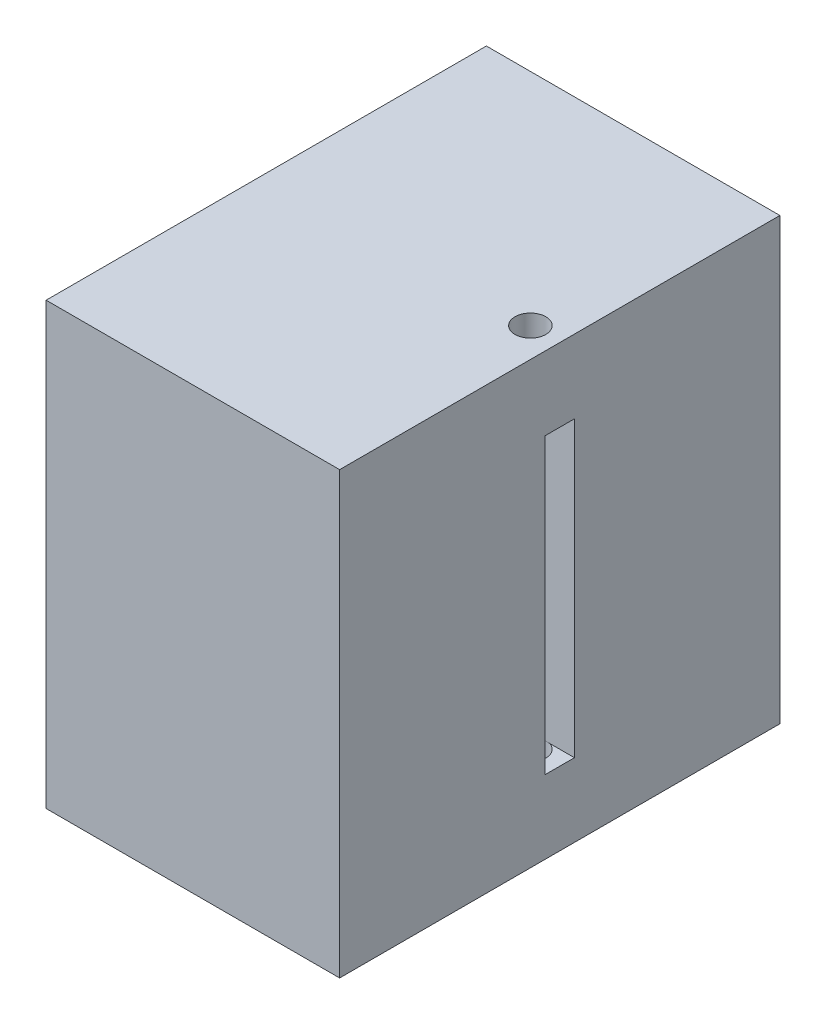
ISO-10303-21;
HEADER;
FILE_DESCRIPTION(('STEP AP214'),'2;1');
FILE_NAME('part.step','',(''),(''),'','','');
FILE_SCHEMA(('AUTOMOTIVE_DESIGN { 1 0 10303 214 1 1 1 1 }'));
ENDSEC;
DATA;
#1=APPLICATION_CONTEXT('core data for automotive mechanical design processes');
#2=APPLICATION_PROTOCOL_DEFINITION('international standard','automotive_design',2000,#1);
#3=PRODUCT_CONTEXT('',#1,'mechanical');
#4=PRODUCT('Part','Part','',(#3));
#5=PRODUCT_RELATED_PRODUCT_CATEGORY('part','',(#4));
#6=PRODUCT_DEFINITION_FORMATION('','',#4);
#7=PRODUCT_DEFINITION_CONTEXT('part definition',#1,'design');
#8=PRODUCT_DEFINITION('design','',#6,#7);
#9=PRODUCT_DEFINITION_SHAPE('','',#8);
#10=(LENGTH_UNIT() NAMED_UNIT(*) SI_UNIT(.MILLI.,.METRE.));
#11=(NAMED_UNIT(*) PLANE_ANGLE_UNIT() SI_UNIT($,.RADIAN.));
#12=(NAMED_UNIT(*) SI_UNIT($,.STERADIAN.) SOLID_ANGLE_UNIT());
#13=UNCERTAINTY_MEASURE_WITH_UNIT(LENGTH_MEASURE(1.E-05),#10,'distance_accuracy_value','');
#14=(GEOMETRIC_REPRESENTATION_CONTEXT(3) GLOBAL_UNCERTAINTY_ASSIGNED_CONTEXT((#13)) GLOBAL_UNIT_ASSIGNED_CONTEXT((#10,
#11,#12)) REPRESENTATION_CONTEXT('',''));
#15=CARTESIAN_POINT('',(0.,0.,0.));
#16=DIRECTION('',(0.,0.,1.));
#17=DIRECTION('',(1.,0.,0.));
#18=AXIS2_PLACEMENT_3D('',#15,#16,#17);
#19=CARTESIAN_POINT('',(0.,20.6632703270842,0.));
#20=DIRECTION('',(0.,1.,0.));
#21=DIRECTION('',(0.,0.,1.));
#22=AXIS2_PLACEMENT_3D('',#19,#20,#21);
#23=PLANE('',#22);
#24=DIRECTION('',(-1.,0.,0.));
#25=VECTOR('',#24,1.);
#26=CARTESIAN_POINT('',(-27.5446162952668,20.6632703270842,16.));
#27=LINE('',#26,#25);
#28=CARTESIAN_POINT('',(-31.5446162952668,20.6632703270842,16.));
#29=VERTEX_POINT('',#28);
#30=CARTESIAN_POINT('',(-33.2244600833952,20.6632703270842,16.));
#31=VERTEX_POINT('',#30);
#32=EDGE_CURVE('E151',#29,#31,#27,.T.);
#33=ORIENTED_EDGE('',*,*,#32,.T.);
#34=CARTESIAN_POINT('',(-33.5446162952668,20.6632703270842,15.));
#35=DIRECTION('',(0.,1.,0.));
#36=DIRECTION('',(0.,0.,1.));
#37=AXIS2_PLACEMENT_3D('',#34,#35,#36);
#38=CIRCLE('',#37,1.05);
#39=CARTESIAN_POINT('',(-33.2244600833952,20.6632703270842,14.));
#40=VERTEX_POINT('',#39);
#41=EDGE_CURVE('E135',#31,#40,#38,.T.);
#42=ORIENTED_EDGE('',*,*,#41,.T.);
#43=DIRECTION('',(1.,0.,0.));
#44=VECTOR('',#43,1.);
#45=CARTESIAN_POINT('',(-27.5446162952668,20.6632703270842,14.));
#46=LINE('',#45,#44);
#47=CARTESIAN_POINT('',(-31.5446162952668,20.6632703270842,14.));
#48=VERTEX_POINT('',#47);
#49=EDGE_CURVE('E168',#40,#48,#46,.T.);
#50=ORIENTED_EDGE('',*,*,#49,.T.);
#51=DIRECTION('',(0.,0.,-1.));
#52=VECTOR('',#51,1.);
#53=CARTESIAN_POINT('',(-31.5446162952668,20.6632703270842,30.));
#54=LINE('',#53,#52);
#55=EDGE_CURVE('E157',#29,#48,#54,.T.);
#56=ORIENTED_EDGE('',*,*,#55,.F.);
#57=EDGE_LOOP('',(#33,#42,#50,#56));
#58=FACE_BOUND('',#57,.T.);
#59=ADVANCED_FACE('F41',(#58),#23,.F.);
#60=CARTESIAN_POINT('',(0.,0.663270327084182,0.));
#61=DIRECTION('',(0.,1.,0.));
#62=DIRECTION('',(0.,0.,1.));
#63=AXIS2_PLACEMENT_3D('',#60,#61,#62);
#64=PLANE('',#63);
#65=DIRECTION('',(-1.,0.,0.));
#66=VECTOR('',#65,1.);
#67=CARTESIAN_POINT('',(-27.5446162952668,0.663270327084182,16.));
#68=LINE('',#67,#66);
#69=CARTESIAN_POINT('',(-33.8647725071385,0.663270327084182,16.));
#70=VERTEX_POINT('',#69);
#71=CARTESIAN_POINT('',(-35.5446162952668,0.663270327084182,16.));
#72=VERTEX_POINT('',#71);
#73=EDGE_CURVE('E177',#70,#72,#68,.T.);
#74=ORIENTED_EDGE('',*,*,#73,.F.);
#75=CARTESIAN_POINT('',(-33.5446162952668,0.663270327084182,15.));
#76=DIRECTION('',(0.,1.,0.));
#77=DIRECTION('',(0.,0.,1.));
#78=AXIS2_PLACEMENT_3D('',#75,#76,#77);
#79=CIRCLE('',#78,1.05);
#80=CARTESIAN_POINT('',(-33.8647725071385,0.663270327084182,14.));
#81=VERTEX_POINT('',#80);
#82=EDGE_CURVE('E49',#70,#81,#79,.F.);
#83=ORIENTED_EDGE('',*,*,#82,.T.);
#84=DIRECTION('',(1.,0.,0.));
#85=VECTOR('',#84,1.);
#86=CARTESIAN_POINT('',(-27.5446162952668,0.663270327084182,14.));
#87=LINE('',#86,#85);
#88=CARTESIAN_POINT('',(-35.5446162952668,0.663270327084182,14.));
#89=VERTEX_POINT('',#88);
#90=EDGE_CURVE('E250',#89,#81,#87,.T.);
#91=ORIENTED_EDGE('',*,*,#90,.F.);
#92=DIRECTION('',(0.,0.,-1.));
#93=VECTOR('',#92,1.);
#94=CARTESIAN_POINT('',(-35.5446162952668,0.663270327084182,16.));
#95=LINE('',#94,#93);
#96=EDGE_CURVE('E182',#72,#89,#95,.T.);
#97=ORIENTED_EDGE('',*,*,#96,.F.);
#98=EDGE_LOOP('',(#74,#83,#91,#97));
#99=FACE_BOUND('',#98,.T.);
#100=ADVANCED_FACE('F248',(#99),#64,.T.);
#101=CARTESIAN_POINT('',(-51.5446162952668,25.6632703270842,30.));
#102=DIRECTION('',(1.,0.,0.));
#103=DIRECTION('',(0.,0.,-1.));
#104=AXIS2_PLACEMENT_3D('',#101,#102,#103);
#105=PLANE('',#104);
#106=DIRECTION('',(0.,-1.,0.));
#107=VECTOR('',#106,1.);
#108=CARTESIAN_POINT('',(-51.5446162952668,25.6632703270842,0.));
#109=LINE('',#108,#107);
#110=CARTESIAN_POINT('',(-51.5446162952668,25.6632703270842,0.));
#111=VERTEX_POINT('',#110);
#112=CARTESIAN_POINT('',(-51.5446162952668,-4.33672967291582,0.));
#113=VERTEX_POINT('',#112);
#114=EDGE_CURVE('E214',#111,#113,#109,.T.);
#115=ORIENTED_EDGE('',*,*,#114,.T.);
#116=DIRECTION('',(0.,0.,-1.));
#117=VECTOR('',#116,1.);
#118=CARTESIAN_POINT('',(-51.5446162952668,-4.33672967291582,30.));
#119=LINE('',#118,#117);
#120=CARTESIAN_POINT('',(-51.5446162952668,-4.33672967291582,30.));
#121=VERTEX_POINT('',#120);
#122=EDGE_CURVE('E233',#121,#113,#119,.T.);
#123=ORIENTED_EDGE('',*,*,#122,.F.);
#124=DIRECTION('',(0.,-1.,0.));
#125=VECTOR('',#124,1.);
#126=CARTESIAN_POINT('',(-51.5446162952668,25.6632703270842,30.));
#127=LINE('',#126,#125);
#128=CARTESIAN_POINT('',(-51.5446162952668,25.6632703270842,30.));
#129=VERTEX_POINT('',#128);
#130=EDGE_CURVE('E208',#129,#121,#127,.T.);
#131=ORIENTED_EDGE('',*,*,#130,.F.);
#132=DIRECTION('',(0.,0.,-1.));
#133=VECTOR('',#132,1.);
#134=CARTESIAN_POINT('',(-51.5446162952668,25.6632703270842,30.));
#135=LINE('',#134,#133);
#136=EDGE_CURVE('E201',#129,#111,#135,.T.);
#137=ORIENTED_EDGE('',*,*,#136,.T.);
#138=EDGE_LOOP('',(#115,#123,#131,#137));
#139=FACE_BOUND('',#138,.T.);
#140=ADVANCED_FACE('F43',(#139),#105,.F.);
#141=CARTESIAN_POINT('',(-51.5446162952668,-4.33672967291582,30.));
#142=DIRECTION('',(0.,1.,0.));
#143=DIRECTION('',(0.,0.,1.));
#144=AXIS2_PLACEMENT_3D('',#141,#142,#143);
#145=PLANE('',#144);
#146=CARTESIAN_POINT('',(-33.5446162952668,-4.33672967291582,15.));
#147=DIRECTION('',(0.,1.,0.));
#148=DIRECTION('',(0.,0.,1.));
#149=AXIS2_PLACEMENT_3D('',#146,#147,#148);
#150=CIRCLE('',#149,1.05);
#151=CARTESIAN_POINT('',(-33.5446162952668,-4.33672967291582,16.05));
#152=VERTEX_POINT('',#151);
#153=EDGE_CURVE('E179',#152,#152,#150,.F.);
#154=ORIENTED_EDGE('',*,*,#153,.F.);
#155=EDGE_LOOP('',(#154));
#156=FACE_BOUND('',#155,.T.);
#157=DIRECTION('',(1.,0.,0.));
#158=VECTOR('',#157,1.);
#159=CARTESIAN_POINT('',(-51.5446162952668,-4.33672967291582,0.));
#160=LINE('',#159,#158);
#161=CARTESIAN_POINT('',(-31.5446162952668,-4.33672967291582,0.));
#162=VERTEX_POINT('',#161);
#163=EDGE_CURVE('E219',#113,#162,#160,.T.);
#164=ORIENTED_EDGE('',*,*,#163,.T.);
#165=DIRECTION('',(0.,0.,-1.));
#166=VECTOR('',#165,1.);
#167=CARTESIAN_POINT('',(-31.5446162952668,-4.33672967291582,30.));
#168=LINE('',#167,#166);
#169=CARTESIAN_POINT('',(-31.5446162952668,-4.33672967291582,30.));
#170=VERTEX_POINT('',#169);
#171=EDGE_CURVE('E230',#170,#162,#168,.T.);
#172=ORIENTED_EDGE('',*,*,#171,.F.);
#173=DIRECTION('',(1.,0.,0.));
#174=VECTOR('',#173,1.);
#175=CARTESIAN_POINT('',(-51.5446162952668,-4.33672967291582,30.));
#176=LINE('',#175,#174);
#177=EDGE_CURVE('E266',#121,#170,#176,.T.);
#178=ORIENTED_EDGE('',*,*,#177,.F.);
#179=ORIENTED_EDGE('',*,*,#122,.T.);
#180=EDGE_LOOP('',(#164,#172,#178,#179));
#181=FACE_BOUND('',#180,.T.);
#182=ADVANCED_FACE('F272',(#156,#181),#145,.F.);
#183=CARTESIAN_POINT('',(-31.5446162952668,25.6632703270842,30.));
#184=DIRECTION('',(-1.,0.,0.));
#185=DIRECTION('',(0.,0.,1.));
#186=AXIS2_PLACEMENT_3D('',#183,#184,#185);
#187=PLANE('',#186);
#188=DIRECTION('',(0.,1.,0.));
#189=VECTOR('',#188,1.);
#190=CARTESIAN_POINT('',(-31.5446162952668,25.6632703270842,16.));
#191=LINE('',#190,#189);
#192=CARTESIAN_POINT('',(-31.5446162952668,0.663270327084183,16.));
#193=VERTEX_POINT('',#192);
#194=EDGE_CURVE('E241',#193,#29,#191,.T.);
#195=ORIENTED_EDGE('',*,*,#194,.T.);
#196=ORIENTED_EDGE('',*,*,#55,.T.);
#197=DIRECTION('',(0.,-1.,0.));
#198=VECTOR('',#197,1.);
#199=CARTESIAN_POINT('',(-31.5446162952668,25.6632703270842,14.));
#200=LINE('',#199,#198);
#201=CARTESIAN_POINT('',(-31.5446162952668,0.663270327084182,14.));
#202=VERTEX_POINT('',#201);
#203=EDGE_CURVE('E238',#48,#202,#200,.T.);
#204=ORIENTED_EDGE('',*,*,#203,.T.);
#205=DIRECTION('',(0.,0.,-1.));
#206=VECTOR('',#205,1.);
#207=CARTESIAN_POINT('',(-31.5446162952668,0.663270327084183,30.));
#208=LINE('',#207,#206);
#209=EDGE_CURVE('E235',#193,#202,#208,.T.);
#210=ORIENTED_EDGE('',*,*,#209,.F.);
#211=EDGE_LOOP('',(#195,#196,#204,#210));
#212=FACE_BOUND('',#211,.T.);
#213=DIRECTION('',(0.,1.,0.));
#214=VECTOR('',#213,1.);
#215=CARTESIAN_POINT('',(-31.5446162952668,25.6632703270842,0.));
#216=LINE('',#215,#214);
#217=CARTESIAN_POINT('',(-31.5446162952668,25.6632703270842,0.));
#218=VERTEX_POINT('',#217);
#219=EDGE_CURVE('E209',#162,#218,#216,.T.);
#220=ORIENTED_EDGE('',*,*,#219,.T.);
#221=DIRECTION('',(0.,0.,-1.));
#222=VECTOR('',#221,1.);
#223=CARTESIAN_POINT('',(-31.5446162952668,25.6632703270842,30.));
#224=LINE('',#223,#222);
#225=CARTESIAN_POINT('',(-31.5446162952668,25.6632703270842,30.));
#226=VERTEX_POINT('',#225);
#227=EDGE_CURVE('E204',#226,#218,#224,.T.);
#228=ORIENTED_EDGE('',*,*,#227,.F.);
#229=DIRECTION('',(0.,1.,0.));
#230=VECTOR('',#229,1.);
#231=CARTESIAN_POINT('',(-31.5446162952668,25.6632703270842,30.));
#232=LINE('',#231,#230);
#233=EDGE_CURVE('E267',#170,#226,#232,.T.);
#234=ORIENTED_EDGE('',*,*,#233,.F.);
#235=ORIENTED_EDGE('',*,*,#171,.T.);
#236=EDGE_LOOP('',(#220,#228,#234,#235));
#237=FACE_BOUND('',#236,.T.);
#238=ADVANCED_FACE('F193',(#212,#237),#187,.F.);
#239=CARTESIAN_POINT('',(-51.5446162952668,25.6632703270842,30.));
#240=DIRECTION('',(0.,-1.,0.));
#241=DIRECTION('',(0.,0.,-1.));
#242=AXIS2_PLACEMENT_3D('',#239,#240,#241);
#243=PLANE('',#242);
#244=CARTESIAN_POINT('',(-33.5446162952668,25.6632703270842,15.));
#245=DIRECTION('',(0.,1.,0.));
#246=DIRECTION('',(0.,0.,1.));
#247=AXIS2_PLACEMENT_3D('',#244,#245,#246);
#248=CIRCLE('',#247,1.05);
#249=CARTESIAN_POINT('',(-33.5446162952668,25.6632703270842,16.05));
#250=VERTEX_POINT('',#249);
#251=EDGE_CURVE('E133',#250,#250,#248,.T.);
#252=ORIENTED_EDGE('',*,*,#251,.F.);
#253=EDGE_LOOP('',(#252));
#254=FACE_BOUND('',#253,.T.);
#255=DIRECTION('',(-1.,0.,0.));
#256=VECTOR('',#255,1.);
#257=CARTESIAN_POINT('',(-51.5446162952668,25.6632703270842,0.));
#258=LINE('',#257,#256);
#259=EDGE_CURVE('E198',#218,#111,#258,.T.);
#260=ORIENTED_EDGE('',*,*,#259,.T.);
#261=ORIENTED_EDGE('',*,*,#136,.F.);
#262=DIRECTION('',(-1.,0.,0.));
#263=VECTOR('',#262,1.);
#264=CARTESIAN_POINT('',(-51.5446162952668,25.6632703270842,30.));
#265=LINE('',#264,#263);
#266=EDGE_CURVE('E216',#226,#129,#265,.T.);
#267=ORIENTED_EDGE('',*,*,#266,.F.);
#268=ORIENTED_EDGE('',*,*,#227,.T.);
#269=EDGE_LOOP('',(#260,#261,#267,#268));
#270=FACE_BOUND('',#269,.T.);
#271=ADVANCED_FACE('F189',(#254,#270),#243,.F.);
#272=CARTESIAN_POINT('',(0.,0.,30.));
#273=DIRECTION('',(0.,0.,1.));
#274=DIRECTION('',(1.,0.,0.));
#275=AXIS2_PLACEMENT_3D('',#272,#273,#274);
#276=PLANE('',#275);
#277=ORIENTED_EDGE('',*,*,#130,.T.);
#278=ORIENTED_EDGE('',*,*,#177,.T.);
#279=ORIENTED_EDGE('',*,*,#233,.T.);
#280=ORIENTED_EDGE('',*,*,#266,.T.);
#281=EDGE_LOOP('',(#277,#278,#279,#280));
#282=FACE_BOUND('',#281,.T.);
#283=ADVANCED_FACE('F192',(#282),#276,.T.);
#284=CARTESIAN_POINT('',(0.,0.,0.));
#285=DIRECTION('',(0.,0.,1.));
#286=DIRECTION('',(1.,0.,0.));
#287=AXIS2_PLACEMENT_3D('',#284,#285,#286);
#288=PLANE('',#287);
#289=ORIENTED_EDGE('',*,*,#114,.F.);
#290=ORIENTED_EDGE('',*,*,#259,.F.);
#291=ORIENTED_EDGE('',*,*,#219,.F.);
#292=ORIENTED_EDGE('',*,*,#163,.F.);
#293=EDGE_LOOP('',(#289,#290,#291,#292));
#294=FACE_BOUND('',#293,.T.);
#295=ADVANCED_FACE('F218',(#294),#288,.F.);
#296=CARTESIAN_POINT('',(-27.5446162952668,20.6632703270842,16.));
#297=DIRECTION('',(0.,0.,1.));
#298=DIRECTION('',(1.,0.,0.));
#299=AXIS2_PLACEMENT_3D('',#296,#297,#298);
#300=PLANE('',#299);
#301=CARTESIAN_POINT('',(-33.2244600833952,0.663270327084182,16.));
#302=VERTEX_POINT('',#301);
#303=EDGE_CURVE('E173',#193,#302,#68,.T.);
#304=ORIENTED_EDGE('',*,*,#303,.T.);
#305=EDGE_CURVE('E175',#302,#70,#68,.T.);
#306=ORIENTED_EDGE('',*,*,#305,.T.);
#307=ORIENTED_EDGE('',*,*,#73,.T.);
#308=DIRECTION('',(0.,-1.,0.));
#309=VECTOR('',#308,1.);
#310=CARTESIAN_POINT('',(-35.5446162952668,20.6632703270842,16.));
#311=LINE('',#310,#309);
#312=CARTESIAN_POINT('',(-35.5446162952668,20.6632703270842,16.));
#313=VERTEX_POINT('',#312);
#314=EDGE_CURVE('E159',#313,#72,#311,.T.);
#315=ORIENTED_EDGE('',*,*,#314,.F.);
#316=CARTESIAN_POINT('',(-33.8647725071385,20.6632703270842,16.));
#317=VERTEX_POINT('',#316);
#318=EDGE_CURVE('E154',#317,#313,#27,.T.);
#319=ORIENTED_EDGE('',*,*,#318,.F.);
#320=EDGE_CURVE('E131',#31,#317,#27,.T.);
#321=ORIENTED_EDGE('',*,*,#320,.F.);
#322=ORIENTED_EDGE('',*,*,#32,.F.);
#323=ORIENTED_EDGE('',*,*,#194,.F.);
#324=EDGE_LOOP('',(#304,#306,#307,#315,#319,#321,#322,#323));
#325=FACE_BOUND('',#324,.T.);
#326=ADVANCED_FACE('F149',(#325),#300,.F.);
#327=CARTESIAN_POINT('',(-27.5446162952668,20.6632703270842,14.));
#328=DIRECTION('',(0.,0.,-1.));
#329=DIRECTION('',(-1.,0.,0.));
#330=AXIS2_PLACEMENT_3D('',#327,#328,#329);
#331=PLANE('',#330);
#332=CARTESIAN_POINT('',(-35.5446162952668,20.6632703270842,14.));
#333=VERTEX_POINT('',#332);
#334=CARTESIAN_POINT('',(-33.8647725071385,20.6632703270842,14.));
#335=VERTEX_POINT('',#334);
#336=EDGE_CURVE('E163',#333,#335,#46,.T.);
#337=ORIENTED_EDGE('',*,*,#336,.F.);
#338=DIRECTION('',(0.,-1.,0.));
#339=VECTOR('',#338,1.);
#340=CARTESIAN_POINT('',(-35.5446162952668,20.6632703270842,14.));
#341=LINE('',#340,#339);
#342=EDGE_CURVE('E158',#333,#89,#341,.T.);
#343=ORIENTED_EDGE('',*,*,#342,.T.);
#344=ORIENTED_EDGE('',*,*,#90,.T.);
#345=CARTESIAN_POINT('',(-33.2244600833952,0.663270327084182,14.));
#346=VERTEX_POINT('',#345);
#347=EDGE_CURVE('E257',#81,#346,#87,.T.);
#348=ORIENTED_EDGE('',*,*,#347,.T.);
#349=EDGE_CURVE('E259',#346,#202,#87,.T.);
#350=ORIENTED_EDGE('',*,*,#349,.T.);
#351=ORIENTED_EDGE('',*,*,#203,.F.);
#352=ORIENTED_EDGE('',*,*,#49,.F.);
#353=EDGE_CURVE('E167',#335,#40,#46,.T.);
#354=ORIENTED_EDGE('',*,*,#353,.F.);
#355=EDGE_LOOP('',(#337,#343,#344,#348,#350,#351,#352,#354));
#356=FACE_BOUND('',#355,.T.);
#357=ADVANCED_FACE('F256',(#356),#331,.F.);
#358=ORIENTED_EDGE('',*,*,#336,.T.);
#359=CARTESIAN_POINT('',(-33.5446162952668,20.6632703270842,15.));
#360=DIRECTION('',(0.,1.,0.));
#361=DIRECTION('',(0.,0.,1.));
#362=AXIS2_PLACEMENT_3D('',#359,#360,#361);
#363=CIRCLE('',#362,1.05);
#364=EDGE_CURVE('E11',#335,#317,#363,.T.);
#365=ORIENTED_EDGE('',*,*,#364,.T.);
#366=ORIENTED_EDGE('',*,*,#318,.T.);
#367=DIRECTION('',(0.,0.,-1.));
#368=VECTOR('',#367,1.);
#369=CARTESIAN_POINT('',(-35.5446162952668,20.6632703270842,16.));
#370=LINE('',#369,#368);
#371=EDGE_CURVE('E171',#313,#333,#370,.T.);
#372=ORIENTED_EDGE('',*,*,#371,.T.);
#373=EDGE_LOOP('',(#358,#365,#366,#372));
#374=FACE_BOUND('',#373,.T.);
#375=ADVANCED_FACE('F282',(#374),#23,.F.);
#376=ORIENTED_EDGE('',*,*,#349,.F.);
#377=CARTESIAN_POINT('',(-33.5446162952668,0.663270327084182,15.));
#378=DIRECTION('',(0.,-1.,0.));
#379=DIRECTION('',(0.,0.,-1.));
#380=AXIS2_PLACEMENT_3D('',#377,#378,#379);
#381=CIRCLE('',#380,1.05);
#382=EDGE_CURVE('E183',#346,#302,#381,.T.);
#383=ORIENTED_EDGE('',*,*,#382,.T.);
#384=ORIENTED_EDGE('',*,*,#303,.F.);
#385=ORIENTED_EDGE('',*,*,#209,.T.);
#386=EDGE_LOOP('',(#376,#383,#384,#385));
#387=FACE_BOUND('',#386,.T.);
#388=ADVANCED_FACE('F289',(#387),#64,.T.);
#389=CARTESIAN_POINT('',(-35.5446162952668,20.6632703270842,16.));
#390=DIRECTION('',(-1.,0.,0.));
#391=DIRECTION('',(0.,0.,1.));
#392=AXIS2_PLACEMENT_3D('',#389,#390,#391);
#393=PLANE('',#392);
#394=ORIENTED_EDGE('',*,*,#96,.T.);
#395=ORIENTED_EDGE('',*,*,#342,.F.);
#396=ORIENTED_EDGE('',*,*,#371,.F.);
#397=ORIENTED_EDGE('',*,*,#314,.T.);
#398=EDGE_LOOP('',(#394,#395,#396,#397));
#399=FACE_BOUND('',#398,.T.);
#400=ADVANCED_FACE('F262',(#399),#393,.F.);
#401=CARTESIAN_POINT('',(0.,0.663270327084182,0.));
#402=DIRECTION('',(0.,-1.,0.));
#403=DIRECTION('',(0.,0.,-1.));
#404=AXIS2_PLACEMENT_3D('',#401,#402,#403);
#405=PLANE('',#404);
#406=ORIENTED_EDGE('',*,*,#305,.F.);
#407=EDGE_CURVE('E64',#302,#70,#381,.T.);
#408=ORIENTED_EDGE('',*,*,#407,.T.);
#409=EDGE_LOOP('',(#406,#408));
#410=FACE_BOUND('',#409,.T.);
#411=ADVANCED_FACE('F306',(#410),#405,.T.);
#412=ORIENTED_EDGE('',*,*,#347,.F.);
#413=EDGE_CURVE('E144',#81,#346,#381,.T.);
#414=ORIENTED_EDGE('',*,*,#413,.T.);
#415=EDGE_LOOP('',(#412,#414));
#416=FACE_BOUND('',#415,.T.);
#417=ADVANCED_FACE('F364',(#416),#405,.T.);
#418=CARTESIAN_POINT('',(-33.5446162952668,-4.33674167291582,15.));
#419=DIRECTION('',(0.,1.,0.));
#420=DIRECTION('',(0.,0.,1.));
#421=AXIS2_PLACEMENT_3D('',#418,#419,#420);
#422=CYLINDRICAL_SURFACE('',#421,1.05);
#423=ORIENTED_EDGE('',*,*,#382,.F.);
#424=ORIENTED_EDGE('',*,*,#413,.F.);
#425=ORIENTED_EDGE('',*,*,#82,.F.);
#426=ORIENTED_EDGE('',*,*,#407,.F.);
#427=EDGE_LOOP('',(#423,#424,#425,#426));
#428=FACE_BOUND('',#427,.T.);
#429=ORIENTED_EDGE('',*,*,#153,.T.);
#430=EDGE_LOOP('',(#429));
#431=FACE_BOUND('',#430,.T.);
#432=ADVANCED_FACE('F379',(#428,#431),#422,.F.);
#433=CARTESIAN_POINT('',(0.,20.6632703270842,0.));
#434=DIRECTION('',(0.,1.,0.));
#435=DIRECTION('',(0.,0.,1.));
#436=AXIS2_PLACEMENT_3D('',#433,#434,#435);
#437=PLANE('',#436);
#438=ORIENTED_EDGE('',*,*,#320,.T.);
#439=EDGE_CURVE('E56',#317,#31,#38,.T.);
#440=ORIENTED_EDGE('',*,*,#439,.T.);
#441=EDGE_LOOP('',(#438,#440));
#442=FACE_BOUND('',#441,.T.);
#443=ADVANCED_FACE('F129',(#442),#437,.T.);
#444=ORIENTED_EDGE('',*,*,#353,.T.);
#445=EDGE_CURVE('E132',#40,#335,#38,.T.);
#446=ORIENTED_EDGE('',*,*,#445,.T.);
#447=EDGE_LOOP('',(#444,#446));
#448=FACE_BOUND('',#447,.T.);
#449=ADVANCED_FACE('F403',(#448),#437,.T.);
#450=CARTESIAN_POINT('',(-33.5446162952668,20.6632703270842,15.));
#451=DIRECTION('',(0.,1.,0.));
#452=DIRECTION('',(0.,0.,1.));
#453=AXIS2_PLACEMENT_3D('',#450,#451,#452);
#454=CYLINDRICAL_SURFACE('',#453,1.05);
#455=ORIENTED_EDGE('',*,*,#41,.F.);
#456=ORIENTED_EDGE('',*,*,#439,.F.);
#457=ORIENTED_EDGE('',*,*,#364,.F.);
#458=ORIENTED_EDGE('',*,*,#445,.F.);
#459=EDGE_LOOP('',(#455,#456,#457,#458));
#460=FACE_BOUND('',#459,.T.);
#461=ORIENTED_EDGE('',*,*,#251,.T.);
#462=EDGE_LOOP('',(#461));
#463=FACE_BOUND('',#462,.T.);
#464=ADVANCED_FACE('F138',(#460,#463),#454,.F.);
#465=CLOSED_SHELL('',(#59,#100,#140,#182,#238,#271,#283,#295,#326,#357,#375,#388,#400,#411,#417,
#432,#443,#449,#464));
#466=MANIFOLD_SOLID_BREP('B2',#465);
#467=ADVANCED_BREP_SHAPE_REPRESENTATION('',(#18,#466),#14);
#468=SHAPE_DEFINITION_REPRESENTATION(#9,#467);
ENDSEC;
END-ISO-10303-21;
